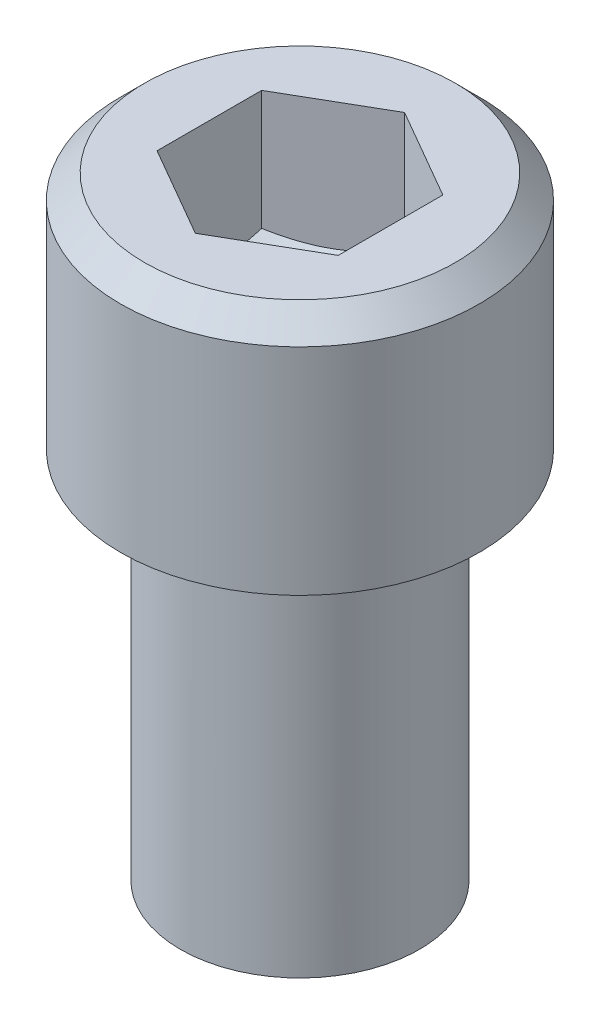
ISO-10303-21;
HEADER;
FILE_DESCRIPTION(('STEP AP214'),'2;1');
FILE_NAME('part.step','',(''),(''),'','','');
FILE_SCHEMA(('AUTOMOTIVE_DESIGN { 1 0 10303 214 1 1 1 1 }'));
ENDSEC;
DATA;
#1=APPLICATION_CONTEXT('core data for automotive mechanical design processes');
#2=APPLICATION_PROTOCOL_DEFINITION('international standard','automotive_design',2000,#1);
#3=PRODUCT_CONTEXT('',#1,'mechanical');
#4=PRODUCT('Part','Part','',(#3));
#5=PRODUCT_RELATED_PRODUCT_CATEGORY('part','',(#4));
#6=PRODUCT_DEFINITION_FORMATION('','',#4);
#7=PRODUCT_DEFINITION_CONTEXT('part definition',#1,'design');
#8=PRODUCT_DEFINITION('design','',#6,#7);
#9=PRODUCT_DEFINITION_SHAPE('','',#8);
#10=(LENGTH_UNIT() NAMED_UNIT(*) SI_UNIT(.MILLI.,.METRE.));
#11=(NAMED_UNIT(*) PLANE_ANGLE_UNIT() SI_UNIT($,.RADIAN.));
#12=(NAMED_UNIT(*) SI_UNIT($,.STERADIAN.) SOLID_ANGLE_UNIT());
#13=UNCERTAINTY_MEASURE_WITH_UNIT(LENGTH_MEASURE(1.E-05),#10,'distance_accuracy_value','');
#14=(GEOMETRIC_REPRESENTATION_CONTEXT(3) GLOBAL_UNCERTAINTY_ASSIGNED_CONTEXT((#13)) GLOBAL_UNIT_ASSIGNED_CONTEXT((#10,
#11,#12)) REPRESENTATION_CONTEXT('',''));
#15=CARTESIAN_POINT('',(0.,0.,0.));
#16=DIRECTION('',(0.,0.,1.));
#17=DIRECTION('',(1.,0.,0.));
#18=AXIS2_PLACEMENT_3D('',#15,#16,#17);
#19=CARTESIAN_POINT('',(0.,0.,0.));
#20=DIRECTION('',(0.,1.,0.));
#21=DIRECTION('',(0.,0.,1.));
#22=AXIS2_PLACEMENT_3D('',#19,#20,#21);
#23=PLANE('',#22);
#24=CARTESIAN_POINT('',(0.,0.,0.));
#25=DIRECTION('',(0.,1.,0.));
#26=DIRECTION('',(0.,0.,1.));
#27=AXIS2_PLACEMENT_3D('',#24,#25,#26);
#28=CIRCLE('',#27,12.);
#29=CARTESIAN_POINT('',(0.,0.,12.));
#30=VERTEX_POINT('',#29);
#31=EDGE_CURVE('E192',#30,#30,#28,.T.);
#32=ORIENTED_EDGE('',*,*,#31,.F.);
#33=EDGE_LOOP('',(#32));
#34=FACE_BOUND('',#33,.T.);
#35=CARTESIAN_POINT('',(0.,0.,0.));
#36=DIRECTION('',(0.,1.,0.));
#37=DIRECTION('',(0.,0.,1.));
#38=AXIS2_PLACEMENT_3D('',#35,#36,#37);
#39=CIRCLE('',#38,8.);
#40=CARTESIAN_POINT('',(0.,0.,8.));
#41=VERTEX_POINT('',#40);
#42=EDGE_CURVE('E11',#41,#41,#39,.F.);
#43=ORIENTED_EDGE('',*,*,#42,.F.);
#44=EDGE_LOOP('',(#43));
#45=FACE_BOUND('',#44,.T.);
#46=ADVANCED_FACE('F32',(#34,#45),#23,.F.);
#47=CARTESIAN_POINT('',(0.,16.,0.));
#48=DIRECTION('',(0.,1.,0.));
#49=DIRECTION('',(0.,0.,1.));
#50=AXIS2_PLACEMENT_3D('',#47,#48,#49);
#51=PLANE('',#50);
#52=CARTESIAN_POINT('',(0.,16.,0.));
#53=DIRECTION('',(0.,1.,0.));
#54=DIRECTION('',(0.,0.,1.));
#55=AXIS2_PLACEMENT_3D('',#52,#53,#54);
#56=CIRCLE('',#55,10.4);
#57=CARTESIAN_POINT('',(0.,16.,10.4));
#58=VERTEX_POINT('',#57);
#59=EDGE_CURVE('E105',#58,#58,#56,.T.);
#60=ORIENTED_EDGE('',*,*,#59,.T.);
#61=EDGE_LOOP('',(#60));
#62=FACE_BOUND('',#61,.T.);
#63=DIRECTION('',(-0.866025403784439,0.,0.5));
#64=VECTOR('',#63,1.);
#65=CARTESIAN_POINT('',(0.,16.,-7.));
#66=LINE('',#65,#64);
#67=CARTESIAN_POINT('',(0.,16.,-7.));
#68=VERTEX_POINT('',#67);
#69=CARTESIAN_POINT('',(-6.06217782649107,16.,-3.5));
#70=VERTEX_POINT('',#69);
#71=EDGE_CURVE('E168',#68,#70,#66,.T.);
#72=ORIENTED_EDGE('',*,*,#71,.F.);
#73=DIRECTION('',(-0.866025403784439,0.,-0.5));
#74=VECTOR('',#73,1.);
#75=CARTESIAN_POINT('',(6.06217782649107,16.,-3.5));
#76=LINE('',#75,#74);
#77=CARTESIAN_POINT('',(6.06217782649107,16.,-3.5));
#78=VERTEX_POINT('',#77);
#79=EDGE_CURVE('E166',#78,#68,#76,.T.);
#80=ORIENTED_EDGE('',*,*,#79,.F.);
#81=DIRECTION('',(0.,0.,-1.));
#82=VECTOR('',#81,1.);
#83=CARTESIAN_POINT('',(6.06217782649107,16.,3.5));
#84=LINE('',#83,#82);
#85=CARTESIAN_POINT('',(6.06217782649107,16.,3.5));
#86=VERTEX_POINT('',#85);
#87=EDGE_CURVE('E177',#86,#78,#84,.T.);
#88=ORIENTED_EDGE('',*,*,#87,.F.);
#89=DIRECTION('',(0.866025403784439,0.,-0.5));
#90=VECTOR('',#89,1.);
#91=CARTESIAN_POINT('',(0.,16.,7.));
#92=LINE('',#91,#90);
#93=CARTESIAN_POINT('',(0.,16.,7.));
#94=VERTEX_POINT('',#93);
#95=EDGE_CURVE('E174',#94,#86,#92,.T.);
#96=ORIENTED_EDGE('',*,*,#95,.F.);
#97=DIRECTION('',(0.866025403784439,0.,0.5));
#98=VECTOR('',#97,1.);
#99=CARTESIAN_POINT('',(-6.06217782649107,16.,3.5));
#100=LINE('',#99,#98);
#101=CARTESIAN_POINT('',(-6.06217782649107,16.,3.5));
#102=VERTEX_POINT('',#101);
#103=EDGE_CURVE('E172',#102,#94,#100,.T.);
#104=ORIENTED_EDGE('',*,*,#103,.F.);
#105=DIRECTION('',(0.,0.,1.));
#106=VECTOR('',#105,1.);
#107=CARTESIAN_POINT('',(-6.06217782649107,16.,-3.5));
#108=LINE('',#107,#106);
#109=EDGE_CURVE('E170',#70,#102,#108,.T.);
#110=ORIENTED_EDGE('',*,*,#109,.F.);
#111=EDGE_LOOP('',(#72,#80,#88,#96,#104,#110));
#112=FACE_BOUND('',#111,.T.);
#113=ADVANCED_FACE('F160',(#62,#112),#51,.T.);
#114=CARTESIAN_POINT('',(0.,16.,0.));
#115=DIRECTION('',(0.,-1.,0.));
#116=DIRECTION('',(0.,0.,-1.));
#117=AXIS2_PLACEMENT_3D('',#114,#115,#116);
#118=CYLINDRICAL_SURFACE('',#117,12.);
#119=CARTESIAN_POINT('',(0.,14.4,0.));
#120=DIRECTION('',(0.,1.,0.));
#121=DIRECTION('',(0.,0.,1.));
#122=AXIS2_PLACEMENT_3D('',#119,#120,#121);
#123=CIRCLE('',#122,12.);
#124=CARTESIAN_POINT('',(0.,14.4,12.));
#125=VERTEX_POINT('',#124);
#126=EDGE_CURVE('E103',#125,#125,#123,.F.);
#127=ORIENTED_EDGE('',*,*,#126,.T.);
#128=EDGE_LOOP('',(#127));
#129=FACE_BOUND('',#128,.T.);
#130=ORIENTED_EDGE('',*,*,#31,.T.);
#131=EDGE_LOOP('',(#130));
#132=FACE_BOUND('',#131,.T.);
#133=ADVANCED_FACE('F158',(#129,#132),#118,.T.);
#134=CARTESIAN_POINT('',(6.06217782649107,16.,-3.5));
#135=DIRECTION('',(-0.5,0.,0.866025403784439));
#136=DIRECTION('',(0.866025403784439,0.,0.5));
#137=AXIS2_PLACEMENT_3D('',#134,#135,#136);
#138=PLANE('',#137);
#139=CARTESIAN_POINT('',(6.06237782649107,8.00006666831621,-3.49988452994616));
#140=CARTESIAN_POINT('',(5.92912408779695,7.95565512750316,-3.57681861185174));
#141=CARTESIAN_POINT('',(5.79537351444597,7.91325912226452,-3.6540395413802));
#142=CARTESIAN_POINT('',(5.52678616690412,7.83305330553866,-3.80910851878441));
#143=CARTESIAN_POINT('',(5.3919489506881,7.79524547247485,-3.88695682186351));
#144=CARTESIAN_POINT('',(4.98527837169377,7.68944633088917,-4.12174819011738));
#145=CARTESIAN_POINT('',(4.71183973549823,7.6292688208156,-4.27961806033172));
#146=CARTESIAN_POINT('',(4.30264378732047,7.55870330173276,-4.51586745116346));
#147=CARTESIAN_POINT('',(4.16810912357467,7.53860116917865,-4.59354107549243));
#148=CARTESIAN_POINT('',(3.89843189372384,7.50489268096088,-4.74923929674112));
#149=CARTESIAN_POINT('',(3.7632893823958,7.49128575136015,-4.82726386203533));
#150=CARTESIAN_POINT('',(3.49276963600485,7.47091444582323,-4.98344851043525));
#151=CARTESIAN_POINT('',(3.35739284278762,7.46414230426793,-5.06160833844124));
#152=CARTESIAN_POINT('',(3.08652166344959,7.45757852306509,-5.21799588674777));
#153=CARTESIAN_POINT('',(2.95102728109065,7.45778666778211,-5.29622360487638));
#154=CARTESIAN_POINT('',(2.57981402398904,7.46795183486945,-5.51054367879076));
#155=CARTESIAN_POINT('',(2.34421665518306,7.48501759207742,-5.64656588309126));
#156=CARTESIAN_POINT('',(1.87458674073017,7.53913394524543,-5.91770684062013));
#157=CARTESIAN_POINT('',(1.64055584677426,7.57620303897014,-6.05282464024427));
#158=CARTESIAN_POINT('',(1.16998075427344,7.66886528773215,-6.32451129657355));
#159=CARTESIAN_POINT('',(0.933495935327413,7.72485105441871,-6.4610458704513));
#160=CARTESIAN_POINT('',(0.464053012749772,7.85191626045842,-6.73207886817066));
#161=CARTESIAN_POINT('',(0.231088896814293,7.92296585151484,-6.86658076321754));
#162=CARTESIAN_POINT('',(-0.000200000000000033,8.00006666831621,-7.00011547005384));
#163=B_SPLINE_CURVE_WITH_KNOTS('',3,(#139,#140,#141,#142,#143,#144,#145,#146,#147,#148,#149,
#150,#151,#152,#153,#154,#155,#156,#157,#158,#159,#160,#161,#162),.UNSPECIFIED.,.F.,.F.,(4,2,2,
2,2,2,2,2,2,2,2,4),(0.,0.480409520935254,0.961025464266979,1.92425449271783,2.39407221456019,
2.86384841410619,3.33309025561129,3.80231760128229,4.61919791533625,5.43683492410929,
6.27260635634963,7.10673696823327),.UNSPECIFIED.);
#164=CARTESIAN_POINT('',(6.06217782649107,8.,-3.5));
#165=VERTEX_POINT('',#164);
#166=CARTESIAN_POINT('',(0.,8.,-7.));
#167=VERTEX_POINT('',#166);
#168=EDGE_CURVE('E98',#165,#167,#163,.T.);
#169=ORIENTED_EDGE('',*,*,#168,.F.);
#170=DIRECTION('',(0.,-1.,0.));
#171=VECTOR('',#170,1.);
#172=CARTESIAN_POINT('',(6.06217782649107,16.,-3.5));
#173=LINE('',#172,#171);
#174=EDGE_CURVE('E179',#78,#165,#173,.T.);
#175=ORIENTED_EDGE('',*,*,#174,.F.);
#176=ORIENTED_EDGE('',*,*,#79,.T.);
#177=DIRECTION('',(0.,-1.,0.));
#178=VECTOR('',#177,1.);
#179=CARTESIAN_POINT('',(0.,16.,-7.));
#180=LINE('',#179,#178);
#181=EDGE_CURVE('E190',#68,#167,#180,.T.);
#182=ORIENTED_EDGE('',*,*,#181,.T.);
#183=EDGE_LOOP('',(#169,#175,#176,#182));
#184=FACE_BOUND('',#183,.T.);
#185=ADVANCED_FACE('F154',(#184),#138,.T.);
#186=CARTESIAN_POINT('',(0.,16.,-7.));
#187=DIRECTION('',(0.5,0.,0.866025403784439));
#188=DIRECTION('',(0.866025403784439,0.,-0.5));
#189=AXIS2_PLACEMENT_3D('',#186,#187,#188);
#190=PLANE('',#189);
#191=CARTESIAN_POINT('',(0.000199999999999635,8.00006666831621,-7.00011547005384));
#192=CARTESIAN_POINT('',(-0.133053738694127,7.95565512750316,-6.92318138814826));
#193=CARTESIAN_POINT('',(-0.266804312045107,7.91325912226452,-6.84596045861981));
#194=CARTESIAN_POINT('',(-0.535391659586951,7.83305330553865,-6.69089148121559));
#195=CARTESIAN_POINT('',(-0.670228875802973,7.79524547247485,-6.6130431781365));
#196=CARTESIAN_POINT('',(-1.0768994547973,7.68944633088917,-6.37825180988262));
#197=CARTESIAN_POINT('',(-1.35033809099284,7.6292688208156,-6.22038193966828));
#198=CARTESIAN_POINT('',(-1.7595340391706,7.55870330173276,-5.98413254883655));
#199=CARTESIAN_POINT('',(-1.8940687029164,7.53860116917865,-5.90645892450758));
#200=CARTESIAN_POINT('',(-2.16374593276723,7.50489268096088,-5.75076070325888));
#201=CARTESIAN_POINT('',(-2.29888844409527,7.49128575136015,-5.67273613796468));
#202=CARTESIAN_POINT('',(-2.56940819048622,7.47091444582323,-5.51655148956475));
#203=CARTESIAN_POINT('',(-2.70478498370345,7.46414230426793,-5.43839166155876));
#204=CARTESIAN_POINT('',(-2.97565616304148,7.45757852306509,-5.28200411325223));
#205=CARTESIAN_POINT('',(-3.11115054540042,7.45778666778211,-5.20377639512362));
#206=CARTESIAN_POINT('',(-3.48236380250203,7.46795183486944,-4.98945632120925));
#207=CARTESIAN_POINT('',(-3.71796117130801,7.48501759207742,-4.85343411690874));
#208=CARTESIAN_POINT('',(-4.1875910857609,7.53913394524543,-4.58229315937987));
#209=CARTESIAN_POINT('',(-4.42162197971681,7.57620303897014,-4.44717535975574));
#210=CARTESIAN_POINT('',(-4.89219707221763,7.66886528773215,-4.17548870342645));
#211=CARTESIAN_POINT('',(-5.12868189116366,7.72485105441871,-4.03895412954871));
#212=CARTESIAN_POINT('',(-5.5981248137413,7.85191626045842,-3.76792113182934));
#213=CARTESIAN_POINT('',(-5.83108892967678,7.92296585151485,-3.63341923678247));
#214=CARTESIAN_POINT('',(-6.06237782649107,8.00006666831621,-3.49988452994616));
#215=B_SPLINE_CURVE_WITH_KNOTS('',3,(#191,#192,#193,#194,#195,#196,#197,#198,#199,#200,#201,
#202,#203,#204,#205,#206,#207,#208,#209,#210,#211,#212,#213,#214),.UNSPECIFIED.,.F.,.F.,(4,2,2,
2,2,2,2,2,2,2,2,4),(0.,0.480409520935256,0.96102546426698,1.92425449271783,2.39407221456018,
2.86384841410619,3.33309025561129,3.80231760128228,4.61919791533625,5.43683492410928,
6.27260635634963,7.10673696823327),.UNSPECIFIED.);
#216=CARTESIAN_POINT('',(-6.06217782649107,8.,-3.5));
#217=VERTEX_POINT('',#216);
#218=EDGE_CURVE('E47',#167,#217,#215,.T.);
#219=ORIENTED_EDGE('',*,*,#218,.F.);
#220=ORIENTED_EDGE('',*,*,#181,.F.);
#221=ORIENTED_EDGE('',*,*,#71,.T.);
#222=DIRECTION('',(0.,-1.,0.));
#223=VECTOR('',#222,1.);
#224=CARTESIAN_POINT('',(-6.06217782649107,16.,-3.5));
#225=LINE('',#224,#223);
#226=EDGE_CURVE('E188',#70,#217,#225,.T.);
#227=ORIENTED_EDGE('',*,*,#226,.T.);
#228=EDGE_LOOP('',(#219,#220,#221,#227));
#229=FACE_BOUND('',#228,.T.);
#230=ADVANCED_FACE('F150',(#229),#190,.T.);
#231=CARTESIAN_POINT('',(-6.06217782649107,16.,-3.5));
#232=DIRECTION('',(1.,0.,0.));
#233=DIRECTION('',(0.,0.,-1.));
#234=AXIS2_PLACEMENT_3D('',#231,#232,#233);
#235=PLANE('',#234);
#236=CARTESIAN_POINT('',(-6.06217782649107,10.2541316440678,-9.06383560580189));
#237=CARTESIAN_POINT('',(-6.06217782649107,10.1285367617893,-8.80204988610162));
#238=CARTESIAN_POINT('',(-6.06217782649107,10.00424640837,-8.53962642062452));
#239=CARTESIAN_POINT('',(-6.06217782649107,9.7590148007169,-8.01316410531011));
#240=CARTESIAN_POINT('',(-6.06217782649107,9.63807414909133,-7.74912497511423));
#241=CARTESIAN_POINT('',(-6.06217782649107,9.39960634041899,-7.21757749607364));
#242=CARTESIAN_POINT('',(-6.06217782649107,9.28210433998352,-6.95005781861676));
#243=CARTESIAN_POINT('',(-6.06217782649107,9.05236941905062,-6.41277360529242));
#244=CARTESIAN_POINT('',(-6.06217782649107,8.94013622475332,-6.14300918693521));
#245=CARTESIAN_POINT('',(-6.06217782649107,8.7194840239534,-5.59370030306958));
#246=CARTESIAN_POINT('',(-6.06217782649107,8.61124146442955,-5.31408454170949));
#247=CARTESIAN_POINT('',(-6.06217782649107,8.40375573249977,-4.75147087980578));
#248=CARTESIAN_POINT('',(-6.06217782649107,8.30451360309614,-4.46847259157254));
#249=CARTESIAN_POINT('',(-6.06217782649107,8.11786260506258,-3.89928474120681));
#250=CARTESIAN_POINT('',(-6.06217782649107,8.03042687053771,-3.61310408501196));
#251=CARTESIAN_POINT('',(-6.06217782649107,7.87039133224267,-3.03666655703987));
#252=CARTESIAN_POINT('',(-6.06217782649107,7.79778654216327,-2.74641109044624));
#253=CARTESIAN_POINT('',(-6.06217782649107,7.67127053345381,-2.16239105541245));
#254=CARTESIAN_POINT('',(-6.06217782649107,7.61732172914816,-1.86863479049593));
#255=CARTESIAN_POINT('',(-6.06217782649107,7.53165477541225,-1.27783575781014));
#256=CARTESIAN_POINT('',(-6.06217782649107,7.49993512369665,-0.980793213511873));
#257=CARTESIAN_POINT('',(-6.06217782649107,7.46166943797705,-0.388625361198958));
#258=CARTESIAN_POINT('',(-6.06217782649107,7.45482633829298,-0.0935197244862763));
#259=CARTESIAN_POINT('',(-6.06217782649107,7.46613015673376,0.496230263927946));
#260=CARTESIAN_POINT('',(-6.06217782649107,7.48427862223838,0.790874585935824));
#261=CARTESIAN_POINT('',(-6.06217782649107,7.53612056081965,1.30108299685085));
#262=CARTESIAN_POINT('',(-6.06217782649107,7.56451899659327,1.51721108360397));
#263=CARTESIAN_POINT('',(-6.06217782649107,7.63280871276492,1.94765703950459));
#264=CARTESIAN_POINT('',(-6.06217782649107,7.67270183881622,2.16197461225277));
#265=CARTESIAN_POINT('',(-6.06217782649107,7.80750100296651,2.80204560944142));
#266=CARTESIAN_POINT('',(-6.06217782649107,7.91749569887285,3.22464461062492));
#267=CARTESIAN_POINT('',(-6.06217782649107,8.10539917904383,3.85650601659878));
#268=CARTESIAN_POINT('',(-6.06217782649107,8.17271937158011,4.06909979741875));
#269=CARTESIAN_POINT('',(-6.06217782649107,8.31362799011477,4.49221989091728));
#270=CARTESIAN_POINT('',(-6.06217782649107,8.38721646110928,4.70274618874255));
#271=CARTESIAN_POINT('',(-6.06217782649107,8.53954146501565,5.12181546384149));
#272=CARTESIAN_POINT('',(-6.06217782649107,8.61827591692225,5.33035920424606));
#273=CARTESIAN_POINT('',(-6.06217782649107,8.78003937328771,5.74576577381176));
#274=CARTESIAN_POINT('',(-6.06217782649107,8.86306830691277,5.95262863063255));
#275=CARTESIAN_POINT('',(-6.06217782649107,9.08033109391723,6.48067142499945));
#276=CARTESIAN_POINT('',(-6.06217782649107,9.21712985704518,6.80079466507828));
#277=CARTESIAN_POINT('',(-6.06217782649107,9.49730791756503,7.43815730467899));
#278=CARTESIAN_POINT('',(-6.06217782649107,9.64068770625278,7.75539648677121));
#279=CARTESIAN_POINT('',(-6.06217782649107,9.93254857876183,8.38761447298054));
#280=CARTESIAN_POINT('',(-6.06217782649107,10.0810309981454,8.70259265882084));
#281=CARTESIAN_POINT('',(-6.06217782649107,10.3819474503537,9.33064004698831));
#282=CARTESIAN_POINT('',(-6.06217782649107,10.5343813760482,9.64370930078534));
#283=CARTESIAN_POINT('',(-6.06217782649107,10.84256953613,10.2686753912445));
#284=CARTESIAN_POINT('',(-6.06217782649107,10.9983275483278,10.5805703617495));
#285=CARTESIAN_POINT('',(-6.06217782649107,11.3123737124566,11.2030839971904));
#286=CARTESIAN_POINT('',(-6.06217782649107,11.4706618783678,11.5137026550623));
#287=CARTESIAN_POINT('',(-6.06217782649107,11.9485389173967,12.4438892168125));
#288=CARTESIAN_POINT('',(-6.06217782649107,12.2711883578306,13.061884298797));
#289=CARTESIAN_POINT('',(-6.06217782649107,12.8913342629804,14.2367390954231));
#290=CARTESIAN_POINT('',(-6.06217782649107,13.1883306306005,14.7938639105365));
#291=CARTESIAN_POINT('',(-6.06217782649107,13.7857111889036,15.9063237998616));
#292=CARTESIAN_POINT('',(-6.06217782649107,14.0860955232628,16.4616587968772));
#293=CARTESIAN_POINT('',(-6.06217782649107,14.6886317542247,17.56953745516));
#294=CARTESIAN_POINT('',(-6.06217782649107,14.9907772116229,18.1220846235087));
#295=CARTESIAN_POINT('',(-6.06217782649107,15.5970330296175,19.2260588544288));
#296=CARTESIAN_POINT('',(-6.06217782649107,15.9011432757635,19.7774859798274));
#297=CARTESIAN_POINT('',(-6.06217782649107,16.2059748865496,20.3285116898406));
#298=B_SPLINE_CURVE_WITH_KNOTS('',3,(#236,#237,#238,#239,#240,#241,#242,#243,#244,#245,#246,
#247,#248,#249,#250,#251,#252,#253,#254,#255,#256,#257,#258,#259,#260,#261,#262,#263,#264,#265,
#266,#267,#268,#269,#270,#271,#272,#273,#274,#275,#276,#277,#278,#279,#280,#281,#282,#283,#284,
#285,#286,#287,#288,#289,#290,#291,#292,#293,#294,#295,#296,#297),.UNSPECIFIED.,.F.,.F.,(4,2,2,
2,2,2,2,2,2,2,2,2,2,2,2,2,2,2,2,2,2,2,2,2,2,2,2,2,2,2,4),(0.,0.871076407877883,1.74230851691658,
2.61882555168769,3.49529698665822,4.39468438295222,5.29417587067942,6.19158473847781,
7.08869139018761,7.98397999094232,8.87920808067846,9.76370993871027,10.648266564093,
11.301900924092,11.9556402939064,13.2639388145048,13.9328857666598,14.6018375211795,
15.270520409484,15.9391922719506,16.983468134776,18.0278220835333,19.0724514951333,
20.1170526150966,21.1629118343158,22.2087768343128,24.3001832511218,26.1942022727418,
28.088301919899,29.9775838638425,31.8667567304779),.UNSPECIFIED.);
#299=CARTESIAN_POINT('',(-6.06217782649107,8.,3.5));
#300=VERTEX_POINT('',#299);
#301=EDGE_CURVE('E55',#217,#300,#298,.T.);
#302=ORIENTED_EDGE('',*,*,#301,.F.);
#303=ORIENTED_EDGE('',*,*,#226,.F.);
#304=ORIENTED_EDGE('',*,*,#109,.T.);
#305=DIRECTION('',(0.,-1.,0.));
#306=VECTOR('',#305,1.);
#307=CARTESIAN_POINT('',(-6.06217782649107,16.,3.5));
#308=LINE('',#307,#306);
#309=EDGE_CURVE('E186',#102,#300,#308,.T.);
#310=ORIENTED_EDGE('',*,*,#309,.T.);
#311=EDGE_LOOP('',(#302,#303,#304,#310));
#312=FACE_BOUND('',#311,.T.);
#313=ADVANCED_FACE('F147',(#312),#235,.T.);
#314=CARTESIAN_POINT('',(-6.06217782649107,16.,3.5));
#315=DIRECTION('',(0.5,0.,-0.866025403784439));
#316=DIRECTION('',(-0.866025403784439,0.,-0.5));
#317=AXIS2_PLACEMENT_3D('',#314,#315,#316);
#318=PLANE('',#317);
#319=CARTESIAN_POINT('',(-6.06237782649107,8.00006666831621,3.49988452994616));
#320=CARTESIAN_POINT('',(-5.92912408779694,7.95565512750316,3.57681861185174));
#321=CARTESIAN_POINT('',(-5.79537351444596,7.91325912226452,3.6540395413802));
#322=CARTESIAN_POINT('',(-5.52678616690412,7.83305330553865,3.80910851878441));
#323=CARTESIAN_POINT('',(-5.3919489506881,7.79524547247485,3.88695682186351));
#324=CARTESIAN_POINT('',(-4.98527837169377,7.68944633088917,4.12174819011738));
#325=CARTESIAN_POINT('',(-4.71183973549823,7.6292688208156,4.27961806033172));
#326=CARTESIAN_POINT('',(-4.30264378732047,7.55870330173276,4.51586745116346));
#327=CARTESIAN_POINT('',(-4.16810912357467,7.53860116917865,4.59354107549243));
#328=CARTESIAN_POINT('',(-3.89843189372384,7.50489268096088,4.74923929674112));
#329=CARTESIAN_POINT('',(-3.7632893823958,7.49128575136015,4.82726386203533));
#330=CARTESIAN_POINT('',(-3.49276963600485,7.47091444582323,4.98344851043525));
#331=CARTESIAN_POINT('',(-3.35739284278762,7.46414230426793,5.06160833844124));
#332=CARTESIAN_POINT('',(-3.08652166344959,7.45757852306509,5.21799588674777));
#333=CARTESIAN_POINT('',(-2.95102728109066,7.45778666778211,5.29622360487638));
#334=CARTESIAN_POINT('',(-2.57981402398904,7.46795183486944,5.51054367879076));
#335=CARTESIAN_POINT('',(-2.34421665518306,7.48501759207742,5.64656588309126));
#336=CARTESIAN_POINT('',(-1.87458674073017,7.53913394524543,5.91770684062013));
#337=CARTESIAN_POINT('',(-1.64055584677426,7.57620303897014,6.05282464024427));
#338=CARTESIAN_POINT('',(-1.16998075427344,7.66886528773215,6.32451129657355));
#339=CARTESIAN_POINT('',(-0.933495935327414,7.72485105441871,6.4610458704513));
#340=CARTESIAN_POINT('',(-0.464053012749772,7.85191626045842,6.73207886817066));
#341=CARTESIAN_POINT('',(-0.231088896814293,7.92296585151485,6.86658076321754));
#342=CARTESIAN_POINT('',(0.000199999999999535,8.00006666831621,7.00011547005384));
#343=B_SPLINE_CURVE_WITH_KNOTS('',3,(#319,#320,#321,#322,#323,#324,#325,#326,#327,#328,#329,
#330,#331,#332,#333,#334,#335,#336,#337,#338,#339,#340,#341,#342),.UNSPECIFIED.,.F.,.F.,(4,2,2,
2,2,2,2,2,2,2,2,4),(0.,0.480409520935256,0.96102546426698,1.92425449271783,2.39407221456018,
2.86384841410619,3.33309025561129,3.80231760128228,4.61919791533625,5.43683492410928,
6.27260635634963,7.10673696823327),.UNSPECIFIED.);
#344=CARTESIAN_POINT('',(0.,8.,7.));
#345=VERTEX_POINT('',#344);
#346=EDGE_CURVE('E132',#300,#345,#343,.T.);
#347=ORIENTED_EDGE('',*,*,#346,.F.);
#348=ORIENTED_EDGE('',*,*,#309,.F.);
#349=ORIENTED_EDGE('',*,*,#103,.T.);
#350=DIRECTION('',(0.,-1.,0.));
#351=VECTOR('',#350,1.);
#352=CARTESIAN_POINT('',(0.,16.,7.));
#353=LINE('',#352,#351);
#354=EDGE_CURVE('E183',#94,#345,#353,.T.);
#355=ORIENTED_EDGE('',*,*,#354,.T.);
#356=EDGE_LOOP('',(#347,#348,#349,#355));
#357=FACE_BOUND('',#356,.T.);
#358=ADVANCED_FACE('F122',(#357),#318,.T.);
#359=CARTESIAN_POINT('',(0.,16.,7.));
#360=DIRECTION('',(-0.5,0.,-0.866025403784439));
#361=DIRECTION('',(-0.866025403784439,0.,0.5));
#362=AXIS2_PLACEMENT_3D('',#359,#360,#361);
#363=PLANE('',#362);
#364=CARTESIAN_POINT('',(-0.000199999999999988,8.00006666831621,7.00011547005384));
#365=CARTESIAN_POINT('',(0.133053738694127,7.95565512750316,6.92318138814826));
#366=CARTESIAN_POINT('',(0.266804312045107,7.91325912226452,6.84596045861981));
#367=CARTESIAN_POINT('',(0.535391659586951,7.83305330553865,6.69089148121559));
#368=CARTESIAN_POINT('',(0.670228875802973,7.79524547247485,6.6130431781365));
#369=CARTESIAN_POINT('',(1.0768994547973,7.68944633088917,6.37825180988262));
#370=CARTESIAN_POINT('',(1.35033809099284,7.6292688208156,6.22038193966828));
#371=CARTESIAN_POINT('',(1.7595340391706,7.55870330173276,5.98413254883655));
#372=CARTESIAN_POINT('',(1.8940687029164,7.53860116917865,5.90645892450757));
#373=CARTESIAN_POINT('',(2.16374593276724,7.50489268096088,5.75076070325888));
#374=CARTESIAN_POINT('',(2.29888844409527,7.49128575136015,5.67273613796468));
#375=CARTESIAN_POINT('',(2.56940819048622,7.47091444582324,5.51655148956475));
#376=CARTESIAN_POINT('',(2.70478498370345,7.46414230426793,5.43839166155876));
#377=CARTESIAN_POINT('',(2.97565616304148,7.45757852306509,5.28200411325223));
#378=CARTESIAN_POINT('',(3.11115054540042,7.45778666778211,5.20377639512362));
#379=CARTESIAN_POINT('',(3.48236380250203,7.46795183486945,4.98945632120925));
#380=CARTESIAN_POINT('',(3.71796117130802,7.48501759207742,4.85343411690874));
#381=CARTESIAN_POINT('',(4.1875910857609,7.53913394524543,4.58229315937987));
#382=CARTESIAN_POINT('',(4.42162197971681,7.57620303897014,4.44717535975573));
#383=CARTESIAN_POINT('',(4.89219707221763,7.66886528773216,4.17548870342645));
#384=CARTESIAN_POINT('',(5.12868189116366,7.72485105441871,4.03895412954871));
#385=CARTESIAN_POINT('',(5.5981248137413,7.85191626045842,3.76792113182934));
#386=CARTESIAN_POINT('',(5.83108892967678,7.92296585151485,3.63341923678247));
#387=CARTESIAN_POINT('',(6.06237782649107,8.00006666831621,3.49988452994616));
#388=B_SPLINE_CURVE_WITH_KNOTS('',3,(#364,#365,#366,#367,#368,#369,#370,#371,#372,#373,#374,
#375,#376,#377,#378,#379,#380,#381,#382,#383,#384,#385,#386,#387),.UNSPECIFIED.,.F.,.F.,(4,2,2,
2,2,2,2,2,2,2,2,4),(0.,0.480409520935256,0.96102546426698,1.92425449271783,2.39407221456019,
2.86384841410619,3.33309025561129,3.80231760128229,4.61919791533625,5.43683492410929,
6.27260635634963,7.10673696823328),.UNSPECIFIED.);
#389=CARTESIAN_POINT('',(6.06217782649107,8.,3.5));
#390=VERTEX_POINT('',#389);
#391=EDGE_CURVE('E100',#345,#390,#388,.T.);
#392=ORIENTED_EDGE('',*,*,#391,.F.);
#393=ORIENTED_EDGE('',*,*,#354,.F.);
#394=ORIENTED_EDGE('',*,*,#95,.T.);
#395=DIRECTION('',(0.,-1.,0.));
#396=VECTOR('',#395,1.);
#397=CARTESIAN_POINT('',(6.06217782649107,16.,3.5));
#398=LINE('',#397,#396);
#399=EDGE_CURVE('E181',#86,#390,#398,.T.);
#400=ORIENTED_EDGE('',*,*,#399,.T.);
#401=EDGE_LOOP('',(#392,#393,#394,#400));
#402=FACE_BOUND('',#401,.T.);
#403=ADVANCED_FACE('F118',(#402),#363,.T.);
#404=CARTESIAN_POINT('',(6.06217782649107,16.,3.5));
#405=DIRECTION('',(-1.,0.,0.));
#406=DIRECTION('',(0.,0.,1.));
#407=AXIS2_PLACEMENT_3D('',#404,#405,#406);
#408=PLANE('',#407);
#409=CARTESIAN_POINT('',(6.06217782649107,10.2541316425033,-9.06383560254188));
#410=CARTESIAN_POINT('',(6.06217782649107,10.1285367602922,-8.80204988295302));
#411=CARTESIAN_POINT('',(6.06217782649107,10.0042464069402,-8.53962641758742));
#412=CARTESIAN_POINT('',(6.06217782649107,9.7590147994215,-8.01316410249641));
#413=CARTESIAN_POINT('',(6.06217782649107,9.63807414786291,-7.74912497241242));
#414=CARTESIAN_POINT('',(6.06217782649107,9.39960633932461,-7.21757749359777));
#415=CARTESIAN_POINT('',(6.06217782649107,9.2821043389562,-6.95005781625492));
#416=CARTESIAN_POINT('',(6.06217782649107,9.05236941815609,-6.41277360315957));
#417=CARTESIAN_POINT('',(6.06217782649107,8.94013622392454,-6.14300918491729));
#418=CARTESIAN_POINT('',(6.06217782649107,8.71948402325653,-5.59370030128822));
#419=CARTESIAN_POINT('',(6.06217782649107,8.61124146379872,-5.31408454004981));
#420=CARTESIAN_POINT('',(6.06217782649107,8.40375573199701,-4.75147087839163));
#421=CARTESIAN_POINT('',(6.06217782649107,8.30451360265539,-4.46847259028224));
#422=CARTESIAN_POINT('',(6.06217782649107,8.11786260473903,-3.89928474016654));
#423=CARTESIAN_POINT('',(6.06217782649107,8.03042687026938,-3.61310408409785));
#424=CARTESIAN_POINT('',(6.06217782649107,7.87039133207446,-3.03666655638167));
#425=CARTESIAN_POINT('',(6.06217782649107,7.79778654203999,-2.74641108991775));
#426=CARTESIAN_POINT('',(6.06217782649107,7.67127053341302,-2.16239105518372));
#427=CARTESIAN_POINT('',(6.06217782649107,7.61732172914266,-1.86863479043774));
#428=CARTESIAN_POINT('',(6.06217782649107,7.53165477545086,-1.27783575809659));
#429=CARTESIAN_POINT('',(6.06217782649107,7.4999351237441,-0.980793213972432));
#430=CARTESIAN_POINT('',(6.06217782649107,7.46166943801164,-0.388625362004488));
#431=CARTESIAN_POINT('',(6.06217782649107,7.45482633830637,-0.0935197254626557));
#432=CARTESIAN_POINT('',(6.06217782649107,7.46613015667645,0.496230262613064));
#433=CARTESIAN_POINT('',(6.06217782649107,7.48427862213155,0.790874584453289));
#434=CARTESIAN_POINT('',(6.06217782649107,7.5361205606143,1.30108299514973));
#435=CARTESIAN_POINT('',(6.06217782649107,7.56451899634794,1.51721108185012));
#436=CARTESIAN_POINT('',(6.06217782649107,7.63280871243738,1.94765703764738));
#437=CARTESIAN_POINT('',(6.06217782649107,7.67270183844645,2.16197461034493));
#438=CARTESIAN_POINT('',(6.06217782649108,7.80750100246901,2.80204560738408));
#439=CARTESIAN_POINT('',(6.06217782649107,7.91749569828886,3.22464460847125));
#440=CARTESIAN_POINT('',(6.06217782649107,8.10539917833162,3.85650601430076));
#441=CARTESIAN_POINT('',(6.06217782649107,8.17271937082479,4.06909979507168));
#442=CARTESIAN_POINT('',(6.06217782649107,8.3136279892743,4.49221988847254));
#443=CARTESIAN_POINT('',(6.06217782649107,8.38721646022678,4.70274618624917));
#444=CARTESIAN_POINT('',(6.06217782649107,8.53954146405031,5.12181546125113));
#445=CARTESIAN_POINT('',(6.06217782649108,8.6182759159161,5.33035920160734));
#446=CARTESIAN_POINT('',(6.06217782649108,8.78003937220111,5.74576577107631));
#447=CARTESIAN_POINT('',(6.06217782649108,8.86306830578653,5.95262862784872));
#448=CARTESIAN_POINT('',(6.06217782649108,9.08033109272861,6.48067142218354));
#449=CARTESIAN_POINT('',(6.06217782649108,9.21712985583708,6.80079466227756));
#450=CARTESIAN_POINT('',(6.06217782649108,9.49730791632337,7.43815730190676));
#451=CARTESIAN_POINT('',(6.06217782649108,9.64068770499704,7.75539648401228));
#452=CARTESIAN_POINT('',(6.06217782649108,9.93254857748192,8.38761447024683));
#453=CARTESIAN_POINT('',(6.06217782649108,10.0810309968554,8.70259265609904));
#454=CARTESIAN_POINT('',(6.06217782649108,10.3819474490463,9.33064004428912));
#455=CARTESIAN_POINT('',(6.06217782649108,10.5343813747336,9.64370929809685));
#456=CARTESIAN_POINT('',(6.06217782649108,10.8425695348034,10.268675388577));
#457=CARTESIAN_POINT('',(6.06217782649108,10.9983275469963,10.5805703590922));
#458=CARTESIAN_POINT('',(6.06217782649108,11.312373711117,11.2030839945529));
#459=CARTESIAN_POINT('',(6.06217782649108,11.470661877025,11.5137026524343));
#460=CARTESIAN_POINT('',(6.06217782649108,11.9485389160459,12.443889214212));
#461=CARTESIAN_POINT('',(6.06217782649108,12.271188356477,13.0618842962136));
#462=CARTESIAN_POINT('',(6.06217782649108,12.8913342616159,14.2367390928552));
#463=CARTESIAN_POINT('',(6.06217782649108,13.1883306292276,14.7938639079673));
#464=CARTESIAN_POINT('',(6.06217782649108,13.7857111875153,15.906323797289));
#465=CARTESIAN_POINT('',(6.06217782649108,14.0860955218677,16.4616587943025));
#466=CARTESIAN_POINT('',(6.06217782649108,14.6886317528157,17.5695374525788));
#467=CARTESIAN_POINT('',(6.06217782649108,14.990777210207,18.122084620923));
#468=CARTESIAN_POINT('',(6.06217782649108,15.5970330281884,19.2260588518337));
#469=CARTESIAN_POINT('',(6.06217782649108,15.9011432743282,19.7774859772274));
#470=CARTESIAN_POINT('',(6.06217782649108,16.2059748851083,20.3285116872356));
#471=B_SPLINE_CURVE_WITH_KNOTS('',3,(#409,#410,#411,#412,#413,#414,#415,#416,#417,#418,#419,
#420,#421,#422,#423,#424,#425,#426,#427,#428,#429,#430,#431,#432,#433,#434,#435,#436,#437,#438,
#439,#440,#441,#442,#443,#444,#445,#446,#447,#448,#449,#450,#451,#452,#453,#454,#455,#456,#457,
#458,#459,#460,#461,#462,#463,#464,#465,#466,#467,#468,#469,#470),.UNSPECIFIED.,.F.,.F.,(4,2,2,
2,2,2,2,2,2,2,2,2,2,2,2,2,2,2,2,2,2,2,2,2,2,2,2,2,2,2,4),(0.,0.871076407489075,1.74230851613889,
2.61882555051586,3.49529698509229,4.39468438097438,5.29417586828951,6.19158473567777,
7.08869138697782,7.98397998721145,8.8792080764272,9.76370993394997,10.6482665588232,
11.3019009186497,11.9556402882916,13.2639388085447,13.9328857605203,14.6018375148607,
15.2705204029861,15.9391922652738,16.9834681281179,18.027822076894,19.0724514885134,
20.1170526084961,21.1629118277362,22.2087768277542,24.3001832446048,26.1942022662093,
28.0883019133512,29.977583857273,31.8667567238863),.UNSPECIFIED.);
#472=EDGE_CURVE('E40',#390,#165,#471,.F.);
#473=ORIENTED_EDGE('',*,*,#472,.F.);
#474=ORIENTED_EDGE('',*,*,#399,.F.);
#475=ORIENTED_EDGE('',*,*,#87,.T.);
#476=ORIENTED_EDGE('',*,*,#174,.T.);
#477=EDGE_LOOP('',(#473,#474,#475,#476));
#478=FACE_BOUND('',#477,.T.);
#479=ADVANCED_FACE('F114',(#478),#408,.T.);
#480=CARTESIAN_POINT('',(0.,16.,0.));
#481=DIRECTION('',(0.,-1.,0.));
#482=DIRECTION('',(0.,0.,-1.));
#483=AXIS2_PLACEMENT_3D('',#480,#481,#482);
#484=CONICAL_SURFACE('',#483,10.4,0.785398163397446);
#485=ORIENTED_EDGE('',*,*,#126,.F.);
#486=EDGE_LOOP('',(#485));
#487=FACE_BOUND('',#486,.T.);
#488=ORIENTED_EDGE('',*,*,#59,.F.);
#489=EDGE_LOOP('',(#488));
#490=FACE_BOUND('',#489,.T.);
#491=ADVANCED_FACE('F34',(#487,#490),#484,.T.);
#492=CARTESIAN_POINT('',(0.,8.,0.));
#493=DIRECTION('',(0.,1.,0.));
#494=DIRECTION('',(-1.,0.,0.));
#495=AXIS2_PLACEMENT_3D('',#492,#493,#494);
#496=CONICAL_SURFACE('',#495,7.,1.0471975511966);
#497=CARTESIAN_POINT('',(0.,3.95854811567264,0.));
#498=VERTEX_POINT('',#497);
#499=VERTEX_LOOP('',#498);
#500=FACE_BOUND('',#499,.T.);
#501=ORIENTED_EDGE('',*,*,#472,.T.);
#502=ORIENTED_EDGE('',*,*,#168,.T.);
#503=ORIENTED_EDGE('',*,*,#218,.T.);
#504=ORIENTED_EDGE('',*,*,#301,.T.);
#505=ORIENTED_EDGE('',*,*,#346,.T.);
#506=ORIENTED_EDGE('',*,*,#391,.T.);
#507=EDGE_LOOP('',(#501,#502,#503,#504,#505,#506));
#508=FACE_BOUND('',#507,.T.);
#509=ADVANCED_FACE('F89',(#500,#508),#496,.F.);
#510=CARTESIAN_POINT('',(0.,-25.,0.));
#511=DIRECTION('',(0.,1.,0.));
#512=DIRECTION('',(0.,0.,1.));
#513=AXIS2_PLACEMENT_3D('',#510,#511,#512);
#514=CYLINDRICAL_SURFACE('',#513,8.);
#515=CARTESIAN_POINT('',(0.,-25.,0.));
#516=DIRECTION('',(0.,-1.,0.));
#517=DIRECTION('',(0.,0.,-1.));
#518=AXIS2_PLACEMENT_3D('',#515,#516,#517);
#519=CIRCLE('',#518,8.);
#520=CARTESIAN_POINT('',(0.,-25.,-8.));
#521=VERTEX_POINT('',#520);
#522=EDGE_CURVE('E133',#521,#521,#519,.T.);
#523=ORIENTED_EDGE('',*,*,#522,.F.);
#524=EDGE_LOOP('',(#523));
#525=FACE_BOUND('',#524,.T.);
#526=ORIENTED_EDGE('',*,*,#42,.T.);
#527=EDGE_LOOP('',(#526));
#528=FACE_BOUND('',#527,.T.);
#529=ADVANCED_FACE('F92',(#525,#528),#514,.T.);
#530=CARTESIAN_POINT('',(0.,-25.,0.));
#531=DIRECTION('',(0.,-1.,0.));
#532=DIRECTION('',(0.,0.,-1.));
#533=AXIS2_PLACEMENT_3D('',#530,#531,#532);
#534=PLANE('',#533);
#535=ORIENTED_EDGE('',*,*,#522,.T.);
#536=EDGE_LOOP('',(#535));
#537=FACE_BOUND('',#536,.T.);
#538=ADVANCED_FACE('F265',(#537),#534,.T.);
#539=CLOSED_SHELL('',(#46,#113,#133,#185,#230,#313,#358,#403,#479,#491,#509,#529,#538));
#540=MANIFOLD_SOLID_BREP('B2',#539);
#541=ADVANCED_BREP_SHAPE_REPRESENTATION('',(#18,#540),#14);
#542=SHAPE_DEFINITION_REPRESENTATION(#9,#541);
ENDSEC;
END-ISO-10303-21;
